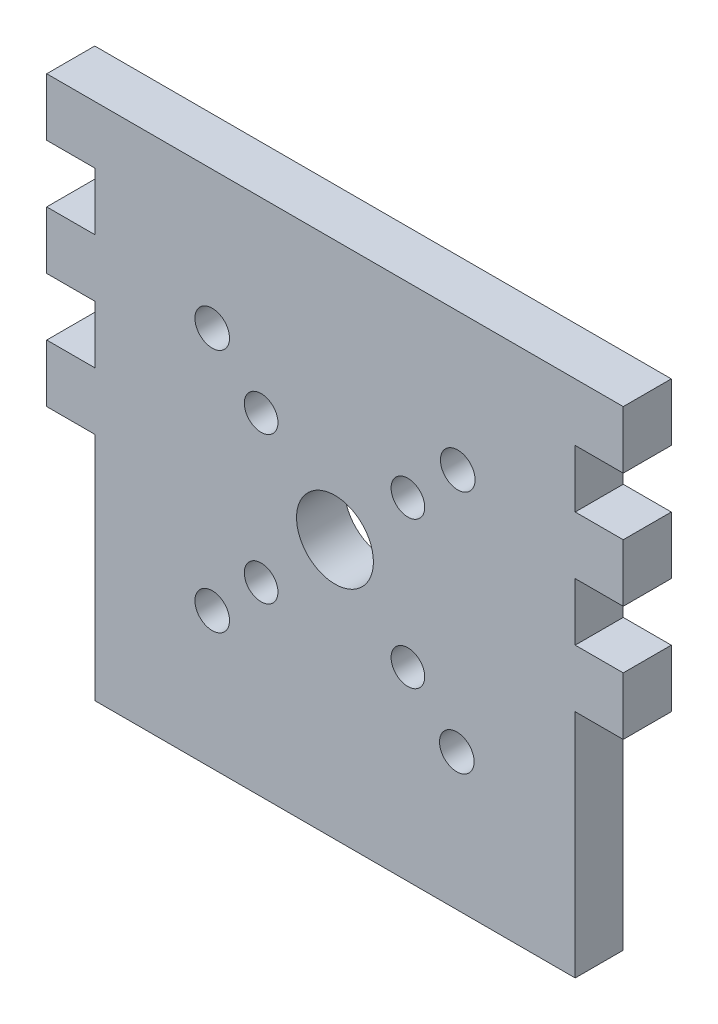
ISO-10303-21;
HEADER;
FILE_DESCRIPTION(('STEP AP214'),'2;1');
FILE_NAME('part.step','',(''),(''),'','','');
FILE_SCHEMA(('AUTOMOTIVE_DESIGN { 1 0 10303 214 1 1 1 1 }'));
ENDSEC;
DATA;
#1=APPLICATION_CONTEXT('core data for automotive mechanical design processes');
#2=APPLICATION_PROTOCOL_DEFINITION('international standard','automotive_design',2000,#1);
#3=PRODUCT_CONTEXT('',#1,'mechanical');
#4=PRODUCT('Part','Part','',(#3));
#5=PRODUCT_RELATED_PRODUCT_CATEGORY('part','',(#4));
#6=PRODUCT_DEFINITION_FORMATION('','',#4);
#7=PRODUCT_DEFINITION_CONTEXT('part definition',#1,'design');
#8=PRODUCT_DEFINITION('design','',#6,#7);
#9=PRODUCT_DEFINITION_SHAPE('','',#8);
#10=(LENGTH_UNIT() NAMED_UNIT(*) SI_UNIT(.MILLI.,.METRE.));
#11=(NAMED_UNIT(*) PLANE_ANGLE_UNIT() SI_UNIT($,.RADIAN.));
#12=(NAMED_UNIT(*) SI_UNIT($,.STERADIAN.) SOLID_ANGLE_UNIT());
#13=UNCERTAINTY_MEASURE_WITH_UNIT(LENGTH_MEASURE(1.E-05),#10,'distance_accuracy_value','');
#14=(GEOMETRIC_REPRESENTATION_CONTEXT(3) GLOBAL_UNCERTAINTY_ASSIGNED_CONTEXT((#13)) GLOBAL_UNIT_ASSIGNED_CONTEXT((#10,
#11,#12)) REPRESENTATION_CONTEXT('',''));
#15=CARTESIAN_POINT('',(0.,0.,0.));
#16=DIRECTION('',(0.,0.,1.));
#17=DIRECTION('',(1.,0.,0.));
#18=AXIS2_PLACEMENT_3D('',#15,#16,#17);
#19=CARTESIAN_POINT('',(0.,0.,6.35));
#20=DIRECTION('',(0.,0.,1.));
#21=DIRECTION('',(1.,0.,0.));
#22=AXIS2_PLACEMENT_3D('',#19,#20,#21);
#23=PLANE('',#22);
#24=CARTESIAN_POINT('',(-9.54141995097613,-15.2310975307996,6.35));
#25=DIRECTION('',(0.,0.,1.));
#26=DIRECTION('',(1.,0.,0.));
#27=AXIS2_PLACEMENT_3D('',#24,#25,#26);
#28=CIRCLE('',#27,2.2225);
#29=CARTESIAN_POINT('',(-7.31891995097614,-15.2310975307996,6.35));
#30=VERTEX_POINT('',#29);
#31=EDGE_CURVE('E826',#30,#30,#28,.T.);
#32=ORIENTED_EDGE('',*,*,#31,.F.);
#33=EDGE_LOOP('',(#32));
#34=FACE_BOUND('',#33,.T.);
#35=CARTESIAN_POINT('',(16.445546790803,-8.76382905717028,6.35));
#36=DIRECTION('',(0.,0.,1.));
#37=DIRECTION('',(-1.,0.,0.));
#38=AXIS2_PLACEMENT_3D('',#35,#36,#37);
#39=CIRCLE('',#38,2.286);
#40=CARTESIAN_POINT('',(14.159546790803,-8.76382905717028,6.35));
#41=VERTEX_POINT('',#40);
#42=EDGE_CURVE('E832',#41,#41,#39,.T.);
#43=ORIENTED_EDGE('',*,*,#42,.F.);
#44=EDGE_LOOP('',(#43));
#45=FACE_BOUND('',#44,.T.);
#46=CARTESIAN_POINT('',(-16.0057199509761,-8.76382905717027,6.35));
#47=DIRECTION('',(0.,0.,1.));
#48=DIRECTION('',(1.,0.,0.));
#49=AXIS2_PLACEMENT_3D('',#46,#47,#48);
#50=CIRCLE('',#49,2.286);
#51=CARTESIAN_POINT('',(-13.7197199509761,-8.76382905717027,6.35));
#52=VERTEX_POINT('',#51);
#53=EDGE_CURVE('E851',#52,#52,#50,.T.);
#54=ORIENTED_EDGE('',*,*,#53,.F.);
#55=EDGE_LOOP('',(#54));
#56=FACE_BOUND('',#55,.T.);
#57=CARTESIAN_POINT('',(-9.54162498368874,-34.6282483603121,6.35));
#58=DIRECTION('',(0.,0.,1.));
#59=DIRECTION('',(1.,0.,0.));
#60=AXIS2_PLACEMENT_3D('',#57,#58,#59);
#61=CIRCLE('',#60,2.2225);
#62=CARTESIAN_POINT('',(-7.31912498368874,-34.6282483603121,6.35));
#63=VERTEX_POINT('',#62);
#64=EDGE_CURVE('E843',#63,#63,#61,.T.);
#65=ORIENTED_EDGE('',*,*,#64,.F.);
#66=EDGE_LOOP('',(#65));
#67=FACE_BOUND('',#66,.T.);
#68=CARTESIAN_POINT('',(9.85552584582378,-34.6284533930247,6.35));
#69=DIRECTION('',(0.,0.,1.));
#70=DIRECTION('',(1.,0.,0.));
#71=AXIS2_PLACEMENT_3D('',#68,#69,#70);
#72=CIRCLE('',#71,2.2225);
#73=CARTESIAN_POINT('',(12.0780258458238,-34.6284533930247,6.35));
#74=VERTEX_POINT('',#73);
#75=EDGE_CURVE('E884',#74,#74,#72,.T.);
#76=ORIENTED_EDGE('',*,*,#75,.F.);
#77=EDGE_LOOP('',(#76));
#78=FACE_BOUND('',#77,.T.);
#79=CARTESIAN_POINT('',(-16.005719950975,-41.0927510930191,6.35));
#80=DIRECTION('',(0.,0.,1.));
#81=DIRECTION('',(1.,0.,0.));
#82=AXIS2_PLACEMENT_3D('',#79,#80,#81);
#83=CIRCLE('',#82,2.286);
#84=CARTESIAN_POINT('',(-13.719719950975,-41.0927510930191,6.35));
#85=VERTEX_POINT('',#84);
#86=EDGE_CURVE('E892',#85,#85,#83,.T.);
#87=ORIENTED_EDGE('',*,*,#86,.F.);
#88=EDGE_LOOP('',(#87));
#89=FACE_BOUND('',#88,.T.);
#90=CARTESIAN_POINT('',(16.323202084874,-41.092751093018,6.35));
#91=DIRECTION('',(0.,0.,1.));
#92=DIRECTION('',(1.,0.,0.));
#93=AXIS2_PLACEMENT_3D('',#90,#91,#92);
#94=CIRCLE('',#93,2.286);
#95=CARTESIAN_POINT('',(18.609202084874,-41.092751093018,6.35));
#96=VERTEX_POINT('',#95);
#97=EDGE_CURVE('E872',#96,#96,#94,.T.);
#98=ORIENTED_EDGE('',*,*,#97,.F.);
#99=EDGE_LOOP('',(#98));
#100=FACE_BOUND('',#99,.T.);
#101=CARTESIAN_POINT('',(9.85573087853638,-15.2313025635122,6.35));
#102=DIRECTION('',(0.,0.,1.));
#103=DIRECTION('',(1.,0.,0.));
#104=AXIS2_PLACEMENT_3D('',#101,#102,#103);
#105=CIRCLE('',#104,2.2225);
#106=CARTESIAN_POINT('',(12.0782308785364,-15.2313025635122,6.35));
#107=VERTEX_POINT('',#106);
#108=EDGE_CURVE('E835',#107,#107,#105,.T.);
#109=ORIENTED_EDGE('',*,*,#108,.F.);
#110=EDGE_LOOP('',(#109));
#111=FACE_BOUND('',#110,.T.);
#112=CARTESIAN_POINT('',(0.219913419913426,-24.86670995671,6.35));
#113=DIRECTION('',(0.,0.,1.));
#114=DIRECTION('',(1.,0.,0.));
#115=AXIS2_PLACEMENT_3D('',#112,#113,#114);
#116=CIRCLE('',#115,5.08);
#117=CARTESIAN_POINT('',(5.29991341991343,-24.86670995671,6.35));
#118=VERTEX_POINT('',#117);
#119=EDGE_CURVE('E240',#118,#118,#116,.T.);
#120=ORIENTED_EDGE('',*,*,#119,.F.);
#121=EDGE_LOOP('',(#120));
#122=FACE_BOUND('',#121,.T.);
#123=DIRECTION('',(0.,1.,0.));
#124=VECTOR('',#123,1.);
#125=CARTESIAN_POINT('',(38.3199134199134,17.04329004329,6.35));
#126=LINE('',#125,#124);
#127=CARTESIAN_POINT('',(38.3199134199135,1.80329004329005,6.35));
#128=VERTEX_POINT('',#127);
#129=CARTESIAN_POINT('',(38.3199134199135,9.42329004329004,6.35));
#130=VERTEX_POINT('',#129);
#131=EDGE_CURVE('E54',#128,#130,#126,.T.);
#132=ORIENTED_EDGE('',*,*,#131,.T.);
#133=DIRECTION('',(1.,0.,0.));
#134=VECTOR('',#133,1.);
#135=CARTESIAN_POINT('',(-31.5300865800866,9.42329004329005,6.35));
#136=LINE('',#135,#134);
#137=CARTESIAN_POINT('',(-37.8800865800866,9.42329004329005,6.35));
#138=VERTEX_POINT('',#137);
#139=EDGE_CURVE('E347',#138,#130,#136,.T.);
#140=ORIENTED_EDGE('',*,*,#139,.F.);
#141=DIRECTION('',(0.,-1.,0.));
#142=VECTOR('',#141,1.);
#143=CARTESIAN_POINT('',(-37.8800865800866,17.04329004329,6.35));
#144=LINE('',#143,#142);
#145=CARTESIAN_POINT('',(-37.8800865800866,1.80329004329005,6.35));
#146=VERTEX_POINT('',#145);
#147=EDGE_CURVE('E438',#138,#146,#144,.T.);
#148=ORIENTED_EDGE('',*,*,#147,.T.);
#149=DIRECTION('',(-1.,0.,0.));
#150=VECTOR('',#149,1.);
#151=CARTESIAN_POINT('',(-37.8800865800866,1.80329004329005,6.35));
#152=LINE('',#151,#150);
#153=CARTESIAN_POINT('',(-31.5300865800866,1.80329004329005,6.35));
#154=VERTEX_POINT('',#153);
#155=EDGE_CURVE('E344',#154,#146,#152,.T.);
#156=ORIENTED_EDGE('',*,*,#155,.F.);
#157=DIRECTION('',(0.,1.,0.));
#158=VECTOR('',#157,1.);
#159=CARTESIAN_POINT('',(-31.5300865800866,1.80329004329005,6.35));
#160=LINE('',#159,#158);
#161=CARTESIAN_POINT('',(-31.5300865800866,-5.81670995670995,6.35));
#162=VERTEX_POINT('',#161);
#163=EDGE_CURVE('E340',#162,#154,#160,.T.);
#164=ORIENTED_EDGE('',*,*,#163,.F.);
#165=DIRECTION('',(1.,0.,0.));
#166=VECTOR('',#165,1.);
#167=CARTESIAN_POINT('',(-31.5300865800866,-5.81670995670995,6.35));
#168=LINE('',#167,#166);
#169=CARTESIAN_POINT('',(-37.8800865800866,-5.81670995670995,6.35));
#170=VERTEX_POINT('',#169);
#171=EDGE_CURVE('E336',#170,#162,#168,.T.);
#172=ORIENTED_EDGE('',*,*,#171,.F.);
#173=CARTESIAN_POINT('',(-37.8800865800866,-13.4367099567099,6.35));
#174=VERTEX_POINT('',#173);
#175=EDGE_CURVE('E434',#170,#174,#144,.T.);
#176=ORIENTED_EDGE('',*,*,#175,.T.);
#177=DIRECTION('',(-1.,0.,0.));
#178=VECTOR('',#177,1.);
#179=CARTESIAN_POINT('',(-37.8800865800866,-13.4367099567099,6.35));
#180=LINE('',#179,#178);
#181=CARTESIAN_POINT('',(-31.5300865800866,-13.4367099567099,6.35));
#182=VERTEX_POINT('',#181);
#183=EDGE_CURVE('E332',#182,#174,#180,.T.);
#184=ORIENTED_EDGE('',*,*,#183,.F.);
#185=DIRECTION('',(0.,1.,0.));
#186=VECTOR('',#185,1.);
#187=CARTESIAN_POINT('',(-31.5300865800866,-13.4367099567099,6.35));
#188=LINE('',#187,#186);
#189=CARTESIAN_POINT('',(-31.5300865800866,-21.0567099567099,6.35));
#190=VERTEX_POINT('',#189);
#191=EDGE_CURVE('E333',#190,#182,#188,.T.);
#192=ORIENTED_EDGE('',*,*,#191,.F.);
#193=DIRECTION('',(-1.,0.,0.));
#194=VECTOR('',#193,1.);
#195=CARTESIAN_POINT('',(0.,-21.0567099567099,6.35));
#196=LINE('',#195,#194);
#197=CARTESIAN_POINT('',(-37.8800865800866,-21.05670995671,6.35));
#198=VERTEX_POINT('',#197);
#199=EDGE_CURVE('E263',#190,#198,#196,.T.);
#200=ORIENTED_EDGE('',*,*,#199,.T.);
#201=DIRECTION('',(0.,-1.,0.));
#202=VECTOR('',#201,1.);
#203=CARTESIAN_POINT('',(-37.8800865800866,0.,6.35));
#204=LINE('',#203,#202);
#205=CARTESIAN_POINT('',(-37.8800865800866,-28.6767099567099,6.35));
#206=VERTEX_POINT('',#205);
#207=EDGE_CURVE('E253',#198,#206,#204,.T.);
#208=ORIENTED_EDGE('',*,*,#207,.T.);
#209=DIRECTION('',(1.,0.,0.));
#210=VECTOR('',#209,1.);
#211=CARTESIAN_POINT('',(0.,-28.6767099567099,6.35));
#212=LINE('',#211,#210);
#213=CARTESIAN_POINT('',(-31.5300865800866,-28.6767099567099,6.35));
#214=VERTEX_POINT('',#213);
#215=EDGE_CURVE('E275',#206,#214,#212,.T.);
#216=ORIENTED_EDGE('',*,*,#215,.T.);
#217=CARTESIAN_POINT('',(-31.5300865800866,-59.15670995671,6.35));
#218=VERTEX_POINT('',#217);
#219=EDGE_CURVE('E329',#218,#214,#188,.T.);
#220=ORIENTED_EDGE('',*,*,#219,.F.);
#221=DIRECTION('',(1.,0.,0.));
#222=VECTOR('',#221,1.);
#223=CARTESIAN_POINT('',(-37.8800865800866,-59.15670995671,6.35));
#224=LINE('',#223,#222);
#225=CARTESIAN_POINT('',(31.9699134199135,-59.15670995671,6.35));
#226=VERTEX_POINT('',#225);
#227=EDGE_CURVE('E440',#218,#226,#224,.T.);
#228=ORIENTED_EDGE('',*,*,#227,.T.);
#229=DIRECTION('',(0.,-1.,0.));
#230=VECTOR('',#229,1.);
#231=CARTESIAN_POINT('',(31.9699134199135,-13.4367099567099,6.35));
#232=LINE('',#231,#230);
#233=CARTESIAN_POINT('',(31.9699134199135,-28.6767099567099,6.35));
#234=VERTEX_POINT('',#233);
#235=EDGE_CURVE('E409',#234,#226,#232,.T.);
#236=ORIENTED_EDGE('',*,*,#235,.F.);
#237=DIRECTION('',(-1.,0.,0.));
#238=VECTOR('',#237,1.);
#239=CARTESIAN_POINT('',(0.,-28.6767099567099,6.35));
#240=LINE('',#239,#238);
#241=CARTESIAN_POINT('',(38.3199134199134,-28.6767099567099,6.35));
#242=VERTEX_POINT('',#241);
#243=EDGE_CURVE('E245',#242,#234,#240,.T.);
#244=ORIENTED_EDGE('',*,*,#243,.F.);
#245=DIRECTION('',(0.,-1.,0.));
#246=VECTOR('',#245,1.);
#247=CARTESIAN_POINT('',(38.3199134199135,0.,6.35));
#248=LINE('',#247,#246);
#249=CARTESIAN_POINT('',(38.3199134199135,-21.0567099567099,6.35));
#250=VERTEX_POINT('',#249);
#251=EDGE_CURVE('E225',#250,#242,#248,.T.);
#252=ORIENTED_EDGE('',*,*,#251,.F.);
#253=DIRECTION('',(1.,0.,0.));
#254=VECTOR('',#253,1.);
#255=CARTESIAN_POINT('',(0.,-21.0567099567099,6.35));
#256=LINE('',#255,#254);
#257=CARTESIAN_POINT('',(31.9699134199135,-21.0567099567099,6.35));
#258=VERTEX_POINT('',#257);
#259=EDGE_CURVE('E235',#258,#250,#256,.T.);
#260=ORIENTED_EDGE('',*,*,#259,.F.);
#261=CARTESIAN_POINT('',(31.9699134199135,-13.4367099567099,6.35));
#262=VERTEX_POINT('',#261);
#263=EDGE_CURVE('E379',#262,#258,#232,.T.);
#264=ORIENTED_EDGE('',*,*,#263,.F.);
#265=DIRECTION('',(-1.,0.,0.));
#266=VECTOR('',#265,1.);
#267=CARTESIAN_POINT('',(38.3199134199135,-13.4367099567099,6.35));
#268=LINE('',#267,#266);
#269=CARTESIAN_POINT('',(38.3199134199135,-13.4367099567099,6.35));
#270=VERTEX_POINT('',#269);
#271=EDGE_CURVE('E405',#270,#262,#268,.T.);
#272=ORIENTED_EDGE('',*,*,#271,.F.);
#273=CARTESIAN_POINT('',(38.3199134199135,-5.81670995670994,6.35));
#274=VERTEX_POINT('',#273);
#275=EDGE_CURVE('E11',#270,#274,#126,.T.);
#276=ORIENTED_EDGE('',*,*,#275,.T.);
#277=DIRECTION('',(1.,0.,0.));
#278=VECTOR('',#277,1.);
#279=CARTESIAN_POINT('',(31.9699134199135,-5.81670995670994,6.35));
#280=LINE('',#279,#278);
#281=CARTESIAN_POINT('',(31.9699134199135,-5.81670995670994,6.35));
#282=VERTEX_POINT('',#281);
#283=EDGE_CURVE('E402',#282,#274,#280,.T.);
#284=ORIENTED_EDGE('',*,*,#283,.F.);
#285=DIRECTION('',(0.,-1.,0.));
#286=VECTOR('',#285,1.);
#287=CARTESIAN_POINT('',(31.9699134199135,1.80329004329005,6.35));
#288=LINE('',#287,#286);
#289=CARTESIAN_POINT('',(31.9699134199135,1.80329004329005,6.35));
#290=VERTEX_POINT('',#289);
#291=EDGE_CURVE('E398',#290,#282,#288,.T.);
#292=ORIENTED_EDGE('',*,*,#291,.F.);
#293=DIRECTION('',(-1.,0.,0.));
#294=VECTOR('',#293,1.);
#295=CARTESIAN_POINT('',(38.3199134199135,1.80329004329005,6.35));
#296=LINE('',#295,#294);
#297=EDGE_CURVE('E300',#128,#290,#296,.T.);
#298=ORIENTED_EDGE('',*,*,#297,.F.);
#299=EDGE_LOOP('',(#132,#140,#148,#156,#164,#172,#176,#184,#192,#200,#208,#216,#220,#228,#236,
#244,#252,#260,#264,#272,#276,#284,#292,#298));
#300=FACE_BOUND('',#299,.T.);
#301=ADVANCED_FACE('F44',(#34,#45,#56,#67,#78,#89,#100,#111,#122,#300),#23,.T.);
#302=CARTESIAN_POINT('',(0.,0.,0.));
#303=DIRECTION('',(0.,0.,1.));
#304=DIRECTION('',(1.,0.,0.));
#305=AXIS2_PLACEMENT_3D('',#302,#303,#304);
#306=PLANE('',#305);
#307=CARTESIAN_POINT('',(-9.54141995097613,-15.2310975307996,0.));
#308=DIRECTION('',(0.,0.,1.));
#309=DIRECTION('',(1.,0.,0.));
#310=AXIS2_PLACEMENT_3D('',#307,#308,#309);
#311=CIRCLE('',#310,2.2225);
#312=CARTESIAN_POINT('',(-7.31891995097614,-15.2310975307996,0.));
#313=VERTEX_POINT('',#312);
#314=EDGE_CURVE('E824',#313,#313,#311,.T.);
#315=ORIENTED_EDGE('',*,*,#314,.T.);
#316=EDGE_LOOP('',(#315));
#317=FACE_BOUND('',#316,.T.);
#318=CARTESIAN_POINT('',(16.445546790803,-8.76382905717028,0.));
#319=DIRECTION('',(0.,0.,1.));
#320=DIRECTION('',(-1.,0.,0.));
#321=AXIS2_PLACEMENT_3D('',#318,#319,#320);
#322=CIRCLE('',#321,2.286);
#323=CARTESIAN_POINT('',(14.159546790803,-8.76382905717028,0.));
#324=VERTEX_POINT('',#323);
#325=EDGE_CURVE('E854',#324,#324,#322,.T.);
#326=ORIENTED_EDGE('',*,*,#325,.T.);
#327=EDGE_LOOP('',(#326));
#328=FACE_BOUND('',#327,.T.);
#329=CARTESIAN_POINT('',(-16.0057199509761,-8.76382905717027,0.));
#330=DIRECTION('',(0.,0.,1.));
#331=DIRECTION('',(1.,0.,0.));
#332=AXIS2_PLACEMENT_3D('',#329,#330,#331);
#333=CIRCLE('',#332,2.286);
#334=CARTESIAN_POINT('',(-13.7197199509761,-8.76382905717027,0.));
#335=VERTEX_POINT('',#334);
#336=EDGE_CURVE('E847',#335,#335,#333,.T.);
#337=ORIENTED_EDGE('',*,*,#336,.T.);
#338=EDGE_LOOP('',(#337));
#339=FACE_BOUND('',#338,.T.);
#340=CARTESIAN_POINT('',(-9.54162498368874,-34.6282483603121,0.));
#341=DIRECTION('',(0.,0.,1.));
#342=DIRECTION('',(1.,0.,0.));
#343=AXIS2_PLACEMENT_3D('',#340,#341,#342);
#344=CIRCLE('',#343,2.2225);
#345=CARTESIAN_POINT('',(-7.31912498368874,-34.6282483603121,0.));
#346=VERTEX_POINT('',#345);
#347=EDGE_CURVE('E839',#346,#346,#344,.T.);
#348=ORIENTED_EDGE('',*,*,#347,.T.);
#349=EDGE_LOOP('',(#348));
#350=FACE_BOUND('',#349,.T.);
#351=CARTESIAN_POINT('',(9.85552584582378,-34.6284533930247,0.));
#352=DIRECTION('',(0.,0.,1.));
#353=DIRECTION('',(1.,0.,0.));
#354=AXIS2_PLACEMENT_3D('',#351,#352,#353);
#355=CIRCLE('',#354,2.2225);
#356=CARTESIAN_POINT('',(12.0780258458238,-34.6284533930247,0.));
#357=VERTEX_POINT('',#356);
#358=EDGE_CURVE('E888',#357,#357,#355,.T.);
#359=ORIENTED_EDGE('',*,*,#358,.T.);
#360=EDGE_LOOP('',(#359));
#361=FACE_BOUND('',#360,.T.);
#362=CARTESIAN_POINT('',(-16.005719950975,-41.0927510930191,0.));
#363=DIRECTION('',(0.,0.,1.));
#364=DIRECTION('',(1.,0.,0.));
#365=AXIS2_PLACEMENT_3D('',#362,#363,#364);
#366=CIRCLE('',#365,2.286);
#367=CARTESIAN_POINT('',(-13.719719950975,-41.0927510930191,0.));
#368=VERTEX_POINT('',#367);
#369=EDGE_CURVE('E877',#368,#368,#366,.T.);
#370=ORIENTED_EDGE('',*,*,#369,.T.);
#371=EDGE_LOOP('',(#370));
#372=FACE_BOUND('',#371,.T.);
#373=CARTESIAN_POINT('',(16.323202084874,-41.092751093018,0.));
#374=DIRECTION('',(0.,0.,1.));
#375=DIRECTION('',(1.,0.,0.));
#376=AXIS2_PLACEMENT_3D('',#373,#374,#375);
#377=CIRCLE('',#376,2.286);
#378=CARTESIAN_POINT('',(18.609202084874,-41.092751093018,0.));
#379=VERTEX_POINT('',#378);
#380=EDGE_CURVE('E876',#379,#379,#377,.T.);
#381=ORIENTED_EDGE('',*,*,#380,.T.);
#382=EDGE_LOOP('',(#381));
#383=FACE_BOUND('',#382,.T.);
#384=CARTESIAN_POINT('',(9.85573087853638,-15.2313025635122,0.));
#385=DIRECTION('',(0.,0.,1.));
#386=DIRECTION('',(1.,0.,0.));
#387=AXIS2_PLACEMENT_3D('',#384,#385,#386);
#388=CIRCLE('',#387,2.2225);
#389=CARTESIAN_POINT('',(12.0782308785364,-15.2313025635122,0.));
#390=VERTEX_POINT('',#389);
#391=EDGE_CURVE('E828',#390,#390,#388,.T.);
#392=ORIENTED_EDGE('',*,*,#391,.T.);
#393=EDGE_LOOP('',(#392));
#394=FACE_BOUND('',#393,.T.);
#395=CARTESIAN_POINT('',(0.219913419913426,-24.86670995671,0.));
#396=DIRECTION('',(0.,0.,1.));
#397=DIRECTION('',(1.,0.,0.));
#398=AXIS2_PLACEMENT_3D('',#395,#396,#397);
#399=CIRCLE('',#398,5.08);
#400=CARTESIAN_POINT('',(5.29991341991343,-24.86670995671,0.));
#401=VERTEX_POINT('',#400);
#402=EDGE_CURVE('E248',#401,#401,#399,.T.);
#403=ORIENTED_EDGE('',*,*,#402,.T.);
#404=EDGE_LOOP('',(#403));
#405=FACE_BOUND('',#404,.T.);
#406=DIRECTION('',(1.,0.,0.));
#407=VECTOR('',#406,1.);
#408=CARTESIAN_POINT('',(-31.5300865800866,9.42329004329005,0.));
#409=LINE('',#408,#407);
#410=CARTESIAN_POINT('',(-37.8800865800866,9.42329004329005,0.));
#411=VERTEX_POINT('',#410);
#412=CARTESIAN_POINT('',(38.3199134199135,9.42329004329004,0.));
#413=VERTEX_POINT('',#412);
#414=EDGE_CURVE('E325',#411,#413,#409,.T.);
#415=ORIENTED_EDGE('',*,*,#414,.T.);
#416=DIRECTION('',(0.,1.,0.));
#417=VECTOR('',#416,1.);
#418=CARTESIAN_POINT('',(38.3199134199134,17.04329004329,0.));
#419=LINE('',#418,#417);
#420=CARTESIAN_POINT('',(38.3199134199135,1.80329004329005,0.));
#421=VERTEX_POINT('',#420);
#422=EDGE_CURVE('E48',#421,#413,#419,.T.);
#423=ORIENTED_EDGE('',*,*,#422,.F.);
#424=DIRECTION('',(-1.,0.,0.));
#425=VECTOR('',#424,1.);
#426=CARTESIAN_POINT('',(38.3199134199135,1.80329004329005,0.));
#427=LINE('',#426,#425);
#428=CARTESIAN_POINT('',(31.9699134199135,1.80329004329005,0.));
#429=VERTEX_POINT('',#428);
#430=EDGE_CURVE('E374',#421,#429,#427,.T.);
#431=ORIENTED_EDGE('',*,*,#430,.T.);
#432=DIRECTION('',(0.,-1.,0.));
#433=VECTOR('',#432,1.);
#434=CARTESIAN_POINT('',(31.9699134199135,1.80329004329005,0.));
#435=LINE('',#434,#433);
#436=CARTESIAN_POINT('',(31.9699134199135,-5.81670995670994,0.));
#437=VERTEX_POINT('',#436);
#438=EDGE_CURVE('E378',#429,#437,#435,.T.);
#439=ORIENTED_EDGE('',*,*,#438,.T.);
#440=DIRECTION('',(1.,0.,0.));
#441=VECTOR('',#440,1.);
#442=CARTESIAN_POINT('',(31.9699134199135,-5.81670995670994,0.));
#443=LINE('',#442,#441);
#444=CARTESIAN_POINT('',(38.3199134199135,-5.81670995670994,0.));
#445=VERTEX_POINT('',#444);
#446=EDGE_CURVE('E383',#437,#445,#443,.T.);
#447=ORIENTED_EDGE('',*,*,#446,.T.);
#448=CARTESIAN_POINT('',(38.3199134199135,-13.4367099567099,0.));
#449=VERTEX_POINT('',#448);
#450=EDGE_CURVE('E439',#449,#445,#419,.T.);
#451=ORIENTED_EDGE('',*,*,#450,.F.);
#452=DIRECTION('',(-1.,0.,0.));
#453=VECTOR('',#452,1.);
#454=CARTESIAN_POINT('',(38.3199134199135,-13.4367099567099,0.));
#455=LINE('',#454,#453);
#456=CARTESIAN_POINT('',(31.9699134199135,-13.4367099567099,0.));
#457=VERTEX_POINT('',#456);
#458=EDGE_CURVE('E387',#449,#457,#455,.T.);
#459=ORIENTED_EDGE('',*,*,#458,.T.);
#460=DIRECTION('',(0.,-1.,0.));
#461=VECTOR('',#460,1.);
#462=CARTESIAN_POINT('',(31.9699134199135,-13.4367099567099,0.));
#463=LINE('',#462,#461);
#464=CARTESIAN_POINT('',(31.9699134199135,-21.0567099567099,0.));
#465=VERTEX_POINT('',#464);
#466=EDGE_CURVE('E391',#457,#465,#463,.T.);
#467=ORIENTED_EDGE('',*,*,#466,.T.);
#468=DIRECTION('',(1.,0.,0.));
#469=VECTOR('',#468,1.);
#470=CARTESIAN_POINT('',(0.,-21.0567099567099,0.));
#471=LINE('',#470,#469);
#472=CARTESIAN_POINT('',(38.3199134199135,-21.0567099567099,0.));
#473=VERTEX_POINT('',#472);
#474=EDGE_CURVE('E215',#465,#473,#471,.T.);
#475=ORIENTED_EDGE('',*,*,#474,.T.);
#476=DIRECTION('',(0.,-1.,0.));
#477=VECTOR('',#476,1.);
#478=CARTESIAN_POINT('',(38.3199134199135,0.,0.));
#479=LINE('',#478,#477);
#480=CARTESIAN_POINT('',(38.3199134199134,-28.6767099567099,0.));
#481=VERTEX_POINT('',#480);
#482=EDGE_CURVE('E208',#473,#481,#479,.T.);
#483=ORIENTED_EDGE('',*,*,#482,.T.);
#484=DIRECTION('',(-1.,0.,0.));
#485=VECTOR('',#484,1.);
#486=CARTESIAN_POINT('',(0.,-28.6767099567099,0.));
#487=LINE('',#486,#485);
#488=CARTESIAN_POINT('',(31.9699134199135,-28.6767099567099,0.));
#489=VERTEX_POINT('',#488);
#490=EDGE_CURVE('E212',#481,#489,#487,.T.);
#491=ORIENTED_EDGE('',*,*,#490,.T.);
#492=CARTESIAN_POINT('',(31.9699134199135,-59.15670995671,0.));
#493=VERTEX_POINT('',#492);
#494=EDGE_CURVE('E62',#489,#493,#463,.T.);
#495=ORIENTED_EDGE('',*,*,#494,.T.);
#496=DIRECTION('',(1.,0.,0.));
#497=VECTOR('',#496,1.);
#498=CARTESIAN_POINT('',(-37.8800865800866,-59.15670995671,0.));
#499=LINE('',#498,#497);
#500=CARTESIAN_POINT('',(-31.5300865800866,-59.15670995671,0.));
#501=VERTEX_POINT('',#500);
#502=EDGE_CURVE('E449',#501,#493,#499,.T.);
#503=ORIENTED_EDGE('',*,*,#502,.F.);
#504=DIRECTION('',(0.,1.,0.));
#505=VECTOR('',#504,1.);
#506=CARTESIAN_POINT('',(-31.5300865800866,-13.4367099567099,0.));
#507=LINE('',#506,#505);
#508=CARTESIAN_POINT('',(-31.5300865800866,-28.6767099567099,0.));
#509=VERTEX_POINT('',#508);
#510=EDGE_CURVE('E304',#501,#509,#507,.T.);
#511=ORIENTED_EDGE('',*,*,#510,.T.);
#512=DIRECTION('',(1.,0.,0.));
#513=VECTOR('',#512,1.);
#514=CARTESIAN_POINT('',(0.,-28.6767099567099,0.));
#515=LINE('',#514,#513);
#516=CARTESIAN_POINT('',(-37.8800865800866,-28.6767099567099,0.));
#517=VERTEX_POINT('',#516);
#518=EDGE_CURVE('E262',#517,#509,#515,.T.);
#519=ORIENTED_EDGE('',*,*,#518,.F.);
#520=DIRECTION('',(0.,-1.,0.));
#521=VECTOR('',#520,1.);
#522=CARTESIAN_POINT('',(-37.8800865800866,0.,0.));
#523=LINE('',#522,#521);
#524=CARTESIAN_POINT('',(-37.8800865800866,-21.05670995671,0.));
#525=VERTEX_POINT('',#524);
#526=EDGE_CURVE('E258',#525,#517,#523,.T.);
#527=ORIENTED_EDGE('',*,*,#526,.F.);
#528=DIRECTION('',(-1.,0.,0.));
#529=VECTOR('',#528,1.);
#530=CARTESIAN_POINT('',(0.,-21.0567099567099,0.));
#531=LINE('',#530,#529);
#532=CARTESIAN_POINT('',(-31.5300865800866,-21.0567099567099,0.));
#533=VERTEX_POINT('',#532);
#534=EDGE_CURVE('E267',#533,#525,#531,.T.);
#535=ORIENTED_EDGE('',*,*,#534,.F.);
#536=CARTESIAN_POINT('',(-31.5300865800866,-13.4367099567099,0.));
#537=VERTEX_POINT('',#536);
#538=EDGE_CURVE('E309',#533,#537,#507,.T.);
#539=ORIENTED_EDGE('',*,*,#538,.T.);
#540=DIRECTION('',(-1.,0.,0.));
#541=VECTOR('',#540,1.);
#542=CARTESIAN_POINT('',(-37.8800865800866,-13.4367099567099,0.));
#543=LINE('',#542,#541);
#544=CARTESIAN_POINT('',(-37.8800865800866,-13.4367099567099,0.));
#545=VERTEX_POINT('',#544);
#546=EDGE_CURVE('E308',#537,#545,#543,.T.);
#547=ORIENTED_EDGE('',*,*,#546,.T.);
#548=DIRECTION('',(0.,-1.,0.));
#549=VECTOR('',#548,1.);
#550=CARTESIAN_POINT('',(-37.8800865800866,17.04329004329,0.));
#551=LINE('',#550,#549);
#552=CARTESIAN_POINT('',(-37.8800865800866,-5.81670995670995,0.));
#553=VERTEX_POINT('',#552);
#554=EDGE_CURVE('E353',#553,#545,#551,.T.);
#555=ORIENTED_EDGE('',*,*,#554,.F.);
#556=DIRECTION('',(1.,0.,0.));
#557=VECTOR('',#556,1.);
#558=CARTESIAN_POINT('',(-31.5300865800866,-5.81670995670995,0.));
#559=LINE('',#558,#557);
#560=CARTESIAN_POINT('',(-31.5300865800866,-5.81670995670995,0.));
#561=VERTEX_POINT('',#560);
#562=EDGE_CURVE('E313',#553,#561,#559,.T.);
#563=ORIENTED_EDGE('',*,*,#562,.T.);
#564=DIRECTION('',(0.,1.,0.));
#565=VECTOR('',#564,1.);
#566=CARTESIAN_POINT('',(-31.5300865800866,1.80329004329005,0.));
#567=LINE('',#566,#565);
#568=CARTESIAN_POINT('',(-31.5300865800866,1.80329004329005,0.));
#569=VERTEX_POINT('',#568);
#570=EDGE_CURVE('E317',#561,#569,#567,.T.);
#571=ORIENTED_EDGE('',*,*,#570,.T.);
#572=DIRECTION('',(-1.,0.,0.));
#573=VECTOR('',#572,1.);
#574=CARTESIAN_POINT('',(-37.8800865800866,1.80329004329005,0.));
#575=LINE('',#574,#573);
#576=CARTESIAN_POINT('',(-37.8800865800866,1.80329004329005,0.));
#577=VERTEX_POINT('',#576);
#578=EDGE_CURVE('E321',#569,#577,#575,.T.);
#579=ORIENTED_EDGE('',*,*,#578,.T.);
#580=EDGE_CURVE('E448',#411,#577,#551,.T.);
#581=ORIENTED_EDGE('',*,*,#580,.F.);
#582=EDGE_LOOP('',(#415,#423,#431,#439,#447,#451,#459,#467,#475,#483,#491,#495,#503,#511,#519,
#527,#535,#539,#547,#555,#563,#571,#579,#581));
#583=FACE_BOUND('',#582,.T.);
#584=ADVANCED_FACE('F210',(#317,#328,#339,#350,#361,#372,#383,#394,#405,#583),#306,.F.);
#585=CARTESIAN_POINT('',(31.9699134199135,-13.4367099567099,0.));
#586=DIRECTION('',(-1.,0.,0.));
#587=DIRECTION('',(0.,0.,1.));
#588=AXIS2_PLACEMENT_3D('',#585,#586,#587);
#589=PLANE('',#588);
#590=DIRECTION('',(0.,0.,1.));
#591=VECTOR('',#590,1.);
#592=CARTESIAN_POINT('',(31.9699134199135,-28.6767099567099,0.));
#593=LINE('',#592,#591);
#594=EDGE_CURVE('E233',#489,#234,#593,.T.);
#595=ORIENTED_EDGE('',*,*,#594,.T.);
#596=ORIENTED_EDGE('',*,*,#235,.T.);
#597=DIRECTION('',(0.,0.,1.));
#598=VECTOR('',#597,1.);
#599=CARTESIAN_POINT('',(31.9699134199135,-59.15670995671,0.));
#600=LINE('',#599,#598);
#601=EDGE_CURVE('E285',#493,#226,#600,.T.);
#602=ORIENTED_EDGE('',*,*,#601,.F.);
#603=ORIENTED_EDGE('',*,*,#494,.F.);
#604=EDGE_LOOP('',(#595,#596,#602,#603));
#605=FACE_BOUND('',#604,.T.);
#606=ADVANCED_FACE('F499',(#605),#589,.F.);
#607=DIRECTION('',(0.,0.,1.));
#608=VECTOR('',#607,1.);
#609=CARTESIAN_POINT('',(31.9699134199135,-21.0567099567099,0.));
#610=LINE('',#609,#608);
#611=EDGE_CURVE('E70',#465,#258,#610,.T.);
#612=ORIENTED_EDGE('',*,*,#611,.F.);
#613=ORIENTED_EDGE('',*,*,#466,.F.);
#614=DIRECTION('',(0.,0.,1.));
#615=VECTOR('',#614,1.);
#616=CARTESIAN_POINT('',(31.9699134199135,-13.4367099567099,0.));
#617=LINE('',#616,#615);
#618=EDGE_CURVE('E412',#457,#262,#617,.T.);
#619=ORIENTED_EDGE('',*,*,#618,.T.);
#620=ORIENTED_EDGE('',*,*,#263,.T.);
#621=EDGE_LOOP('',(#612,#613,#619,#620));
#622=FACE_BOUND('',#621,.T.);
#623=ADVANCED_FACE('F494',(#622),#589,.F.);
#624=CARTESIAN_POINT('',(-31.5300865800866,-13.4367099567099,0.));
#625=DIRECTION('',(1.,0.,0.));
#626=DIRECTION('',(0.,0.,-1.));
#627=AXIS2_PLACEMENT_3D('',#624,#625,#626);
#628=PLANE('',#627);
#629=ORIENTED_EDGE('',*,*,#538,.F.);
#630=DIRECTION('',(0.,0.,1.));
#631=VECTOR('',#630,1.);
#632=CARTESIAN_POINT('',(-31.5300865800866,-21.0567099567099,0.));
#633=LINE('',#632,#631);
#634=EDGE_CURVE('E286',#533,#190,#633,.T.);
#635=ORIENTED_EDGE('',*,*,#634,.T.);
#636=ORIENTED_EDGE('',*,*,#191,.T.);
#637=DIRECTION('',(0.,0.,1.));
#638=VECTOR('',#637,1.);
#639=CARTESIAN_POINT('',(-31.5300865800866,-13.4367099567099,0.));
#640=LINE('',#639,#638);
#641=EDGE_CURVE('E328',#537,#182,#640,.T.);
#642=ORIENTED_EDGE('',*,*,#641,.F.);
#643=EDGE_LOOP('',(#629,#635,#636,#642));
#644=FACE_BOUND('',#643,.T.);
#645=ADVANCED_FACE('F506',(#644),#628,.F.);
#646=CARTESIAN_POINT('',(-37.8800865800866,17.04329004329,6.35));
#647=DIRECTION('',(1.,0.,0.));
#648=DIRECTION('',(0.,0.,-1.));
#649=AXIS2_PLACEMENT_3D('',#646,#647,#648);
#650=PLANE('',#649);
#651=ORIENTED_EDGE('',*,*,#147,.F.);
#652=DIRECTION('',(0.,0.,1.));
#653=VECTOR('',#652,1.);
#654=CARTESIAN_POINT('',(-37.8800865800866,9.42329004329005,0.));
#655=LINE('',#654,#653);
#656=EDGE_CURVE('E350',#411,#138,#655,.T.);
#657=ORIENTED_EDGE('',*,*,#656,.F.);
#658=ORIENTED_EDGE('',*,*,#580,.T.);
#659=DIRECTION('',(0.,0.,1.));
#660=VECTOR('',#659,1.);
#661=CARTESIAN_POINT('',(-37.8800865800866,1.80329004329005,0.));
#662=LINE('',#661,#660);
#663=EDGE_CURVE('E354',#577,#146,#662,.T.);
#664=ORIENTED_EDGE('',*,*,#663,.T.);
#665=EDGE_LOOP('',(#651,#657,#658,#664));
#666=FACE_BOUND('',#665,.T.);
#667=ADVANCED_FACE('F46',(#666),#650,.F.);
#668=ORIENTED_EDGE('',*,*,#175,.F.);
#669=DIRECTION('',(0.,0.,1.));
#670=VECTOR('',#669,1.);
#671=CARTESIAN_POINT('',(-37.8800865800866,-5.81670995670995,0.));
#672=LINE('',#671,#670);
#673=EDGE_CURVE('E364',#553,#170,#672,.T.);
#674=ORIENTED_EDGE('',*,*,#673,.F.);
#675=ORIENTED_EDGE('',*,*,#554,.T.);
#676=DIRECTION('',(0.,0.,1.));
#677=VECTOR('',#676,1.);
#678=CARTESIAN_POINT('',(-37.8800865800866,-13.4367099567099,0.));
#679=LINE('',#678,#677);
#680=EDGE_CURVE('E367',#545,#174,#679,.T.);
#681=ORIENTED_EDGE('',*,*,#680,.T.);
#682=EDGE_LOOP('',(#668,#674,#675,#681));
#683=FACE_BOUND('',#682,.T.);
#684=ADVANCED_FACE('F532',(#683),#650,.F.);
#685=CARTESIAN_POINT('',(38.3199134199134,17.04329004329,6.35));
#686=DIRECTION('',(-1.,0.,0.));
#687=DIRECTION('',(0.,-1.,0.));
#688=AXIS2_PLACEMENT_3D('',#685,#686,#687);
#689=PLANE('',#688);
#690=ORIENTED_EDGE('',*,*,#275,.F.);
#691=DIRECTION('',(0.,0.,1.));
#692=VECTOR('',#691,1.);
#693=CARTESIAN_POINT('',(38.3199134199135,-13.4367099567099,0.));
#694=LINE('',#693,#692);
#695=EDGE_CURVE('E415',#449,#270,#694,.T.);
#696=ORIENTED_EDGE('',*,*,#695,.F.);
#697=ORIENTED_EDGE('',*,*,#450,.T.);
#698=DIRECTION('',(0.,0.,1.));
#699=VECTOR('',#698,1.);
#700=CARTESIAN_POINT('',(38.3199134199135,-5.81670995670994,0.));
#701=LINE('',#700,#699);
#702=EDGE_CURVE('E418',#445,#274,#701,.T.);
#703=ORIENTED_EDGE('',*,*,#702,.T.);
#704=EDGE_LOOP('',(#690,#696,#697,#703));
#705=FACE_BOUND('',#704,.T.);
#706=ADVANCED_FACE('F481',(#705),#689,.F.);
#707=CARTESIAN_POINT('',(-37.8800865800866,-59.15670995671,6.35));
#708=DIRECTION('',(0.,1.,0.));
#709=DIRECTION('',(0.,0.,1.));
#710=AXIS2_PLACEMENT_3D('',#707,#708,#709);
#711=PLANE('',#710);
#712=ORIENTED_EDGE('',*,*,#227,.F.);
#713=DIRECTION('',(0.,0.,1.));
#714=VECTOR('',#713,1.);
#715=CARTESIAN_POINT('',(-31.5300865800866,-59.15670995671,0.));
#716=LINE('',#715,#714);
#717=EDGE_CURVE('E296',#501,#218,#716,.T.);
#718=ORIENTED_EDGE('',*,*,#717,.F.);
#719=ORIENTED_EDGE('',*,*,#502,.T.);
#720=ORIENTED_EDGE('',*,*,#601,.T.);
#721=EDGE_LOOP('',(#712,#718,#719,#720));
#722=FACE_BOUND('',#721,.T.);
#723=ADVANCED_FACE('F526',(#722),#711,.F.);
#724=ORIENTED_EDGE('',*,*,#131,.F.);
#725=DIRECTION('',(0.,0.,1.));
#726=VECTOR('',#725,1.);
#727=CARTESIAN_POINT('',(38.3199134199135,1.80329004329005,0.));
#728=LINE('',#727,#726);
#729=EDGE_CURVE('E428',#421,#128,#728,.T.);
#730=ORIENTED_EDGE('',*,*,#729,.F.);
#731=ORIENTED_EDGE('',*,*,#422,.T.);
#732=DIRECTION('',(0.,0.,1.));
#733=VECTOR('',#732,1.);
#734=CARTESIAN_POINT('',(38.3199134199135,9.42329004329004,0.));
#735=LINE('',#734,#733);
#736=EDGE_CURVE('E394',#413,#130,#735,.T.);
#737=ORIENTED_EDGE('',*,*,#736,.T.);
#738=EDGE_LOOP('',(#724,#730,#731,#737));
#739=FACE_BOUND('',#738,.T.);
#740=ADVANCED_FACE('F524',(#739),#689,.F.);
#741=CARTESIAN_POINT('',(38.3199134199135,1.80329004329005,0.));
#742=DIRECTION('',(0.,1.,0.));
#743=DIRECTION('',(0.,0.,1.));
#744=AXIS2_PLACEMENT_3D('',#741,#742,#743);
#745=PLANE('',#744);
#746=ORIENTED_EDGE('',*,*,#297,.T.);
#747=DIRECTION('',(0.,0.,1.));
#748=VECTOR('',#747,1.);
#749=CARTESIAN_POINT('',(31.9699134199135,1.80329004329005,0.));
#750=LINE('',#749,#748);
#751=EDGE_CURVE('E425',#429,#290,#750,.T.);
#752=ORIENTED_EDGE('',*,*,#751,.F.);
#753=ORIENTED_EDGE('',*,*,#430,.F.);
#754=ORIENTED_EDGE('',*,*,#729,.T.);
#755=EDGE_LOOP('',(#746,#752,#753,#754));
#756=FACE_BOUND('',#755,.T.);
#757=ADVANCED_FACE('F521',(#756),#745,.F.);
#758=CARTESIAN_POINT('',(31.9699134199135,1.80329004329005,0.));
#759=DIRECTION('',(-1.,0.,0.));
#760=DIRECTION('',(0.,0.,1.));
#761=AXIS2_PLACEMENT_3D('',#758,#759,#760);
#762=PLANE('',#761);
#763=ORIENTED_EDGE('',*,*,#291,.T.);
#764=DIRECTION('',(0.,0.,1.));
#765=VECTOR('',#764,1.);
#766=CARTESIAN_POINT('',(31.9699134199135,-5.81670995670994,0.));
#767=LINE('',#766,#765);
#768=EDGE_CURVE('E422',#437,#282,#767,.T.);
#769=ORIENTED_EDGE('',*,*,#768,.F.);
#770=ORIENTED_EDGE('',*,*,#438,.F.);
#771=ORIENTED_EDGE('',*,*,#751,.T.);
#772=EDGE_LOOP('',(#763,#769,#770,#771));
#773=FACE_BOUND('',#772,.T.);
#774=ADVANCED_FACE('F601',(#773),#762,.F.);
#775=CARTESIAN_POINT('',(31.9699134199135,-5.81670995670994,0.));
#776=DIRECTION('',(0.,-1.,0.));
#777=DIRECTION('',(0.,0.,-1.));
#778=AXIS2_PLACEMENT_3D('',#775,#776,#777);
#779=PLANE('',#778);
#780=ORIENTED_EDGE('',*,*,#283,.T.);
#781=ORIENTED_EDGE('',*,*,#702,.F.);
#782=ORIENTED_EDGE('',*,*,#446,.F.);
#783=ORIENTED_EDGE('',*,*,#768,.T.);
#784=EDGE_LOOP('',(#780,#781,#782,#783));
#785=FACE_BOUND('',#784,.T.);
#786=ADVANCED_FACE('F484',(#785),#779,.F.);
#787=CARTESIAN_POINT('',(38.3199134199135,-13.4367099567099,0.));
#788=DIRECTION('',(0.,1.,0.));
#789=DIRECTION('',(0.,0.,1.));
#790=AXIS2_PLACEMENT_3D('',#787,#788,#789);
#791=PLANE('',#790);
#792=ORIENTED_EDGE('',*,*,#271,.T.);
#793=ORIENTED_EDGE('',*,*,#618,.F.);
#794=ORIENTED_EDGE('',*,*,#458,.F.);
#795=ORIENTED_EDGE('',*,*,#695,.T.);
#796=EDGE_LOOP('',(#792,#793,#794,#795));
#797=FACE_BOUND('',#796,.T.);
#798=ADVANCED_FACE('F493',(#797),#791,.F.);
#799=ORIENTED_EDGE('',*,*,#219,.T.);
#800=DIRECTION('',(0.,0.,1.));
#801=VECTOR('',#800,1.);
#802=CARTESIAN_POINT('',(-31.5300865800866,-28.6767099567099,0.));
#803=LINE('',#802,#801);
#804=EDGE_CURVE('E290',#509,#214,#803,.T.);
#805=ORIENTED_EDGE('',*,*,#804,.F.);
#806=ORIENTED_EDGE('',*,*,#510,.F.);
#807=ORIENTED_EDGE('',*,*,#717,.T.);
#808=EDGE_LOOP('',(#799,#805,#806,#807));
#809=FACE_BOUND('',#808,.T.);
#810=ADVANCED_FACE('F568',(#809),#628,.F.);
#811=CARTESIAN_POINT('',(-37.8800865800866,-13.4367099567099,0.));
#812=DIRECTION('',(0.,1.,0.));
#813=DIRECTION('',(0.,0.,1.));
#814=AXIS2_PLACEMENT_3D('',#811,#812,#813);
#815=PLANE('',#814);
#816=ORIENTED_EDGE('',*,*,#183,.T.);
#817=ORIENTED_EDGE('',*,*,#680,.F.);
#818=ORIENTED_EDGE('',*,*,#546,.F.);
#819=ORIENTED_EDGE('',*,*,#641,.T.);
#820=EDGE_LOOP('',(#816,#817,#818,#819));
#821=FACE_BOUND('',#820,.T.);
#822=ADVANCED_FACE('F547',(#821),#815,.F.);
#823=CARTESIAN_POINT('',(-31.5300865800866,-5.81670995670995,0.));
#824=DIRECTION('',(0.,-1.,0.));
#825=DIRECTION('',(0.,0.,-1.));
#826=AXIS2_PLACEMENT_3D('',#823,#824,#825);
#827=PLANE('',#826);
#828=ORIENTED_EDGE('',*,*,#171,.T.);
#829=DIRECTION('',(0.,0.,1.));
#830=VECTOR('',#829,1.);
#831=CARTESIAN_POINT('',(-31.5300865800866,-5.81670995670995,0.));
#832=LINE('',#831,#830);
#833=EDGE_CURVE('E361',#561,#162,#832,.T.);
#834=ORIENTED_EDGE('',*,*,#833,.F.);
#835=ORIENTED_EDGE('',*,*,#562,.F.);
#836=ORIENTED_EDGE('',*,*,#673,.T.);
#837=EDGE_LOOP('',(#828,#834,#835,#836));
#838=FACE_BOUND('',#837,.T.);
#839=ADVANCED_FACE('F553',(#838),#827,.F.);
#840=CARTESIAN_POINT('',(-31.5300865800866,1.80329004329005,0.));
#841=DIRECTION('',(1.,0.,0.));
#842=DIRECTION('',(0.,0.,-1.));
#843=AXIS2_PLACEMENT_3D('',#840,#841,#842);
#844=PLANE('',#843);
#845=ORIENTED_EDGE('',*,*,#163,.T.);
#846=DIRECTION('',(0.,0.,1.));
#847=VECTOR('',#846,1.);
#848=CARTESIAN_POINT('',(-31.5300865800866,1.80329004329005,0.));
#849=LINE('',#848,#847);
#850=EDGE_CURVE('E358',#569,#154,#849,.T.);
#851=ORIENTED_EDGE('',*,*,#850,.F.);
#852=ORIENTED_EDGE('',*,*,#570,.F.);
#853=ORIENTED_EDGE('',*,*,#833,.T.);
#854=EDGE_LOOP('',(#845,#851,#852,#853));
#855=FACE_BOUND('',#854,.T.);
#856=ADVANCED_FACE('F555',(#855),#844,.F.);
#857=CARTESIAN_POINT('',(-37.8800865800866,1.80329004329005,0.));
#858=DIRECTION('',(0.,1.,0.));
#859=DIRECTION('',(0.,0.,1.));
#860=AXIS2_PLACEMENT_3D('',#857,#858,#859);
#861=PLANE('',#860);
#862=ORIENTED_EDGE('',*,*,#155,.T.);
#863=ORIENTED_EDGE('',*,*,#663,.F.);
#864=ORIENTED_EDGE('',*,*,#578,.F.);
#865=ORIENTED_EDGE('',*,*,#850,.T.);
#866=EDGE_LOOP('',(#862,#863,#864,#865));
#867=FACE_BOUND('',#866,.T.);
#868=ADVANCED_FACE('F468',(#867),#861,.F.);
#869=CARTESIAN_POINT('',(-31.5300865800866,9.42329004329005,0.));
#870=DIRECTION('',(0.,-1.,0.));
#871=DIRECTION('',(0.,0.,-1.));
#872=AXIS2_PLACEMENT_3D('',#869,#870,#871);
#873=PLANE('',#872);
#874=ORIENTED_EDGE('',*,*,#139,.T.);
#875=ORIENTED_EDGE('',*,*,#736,.F.);
#876=ORIENTED_EDGE('',*,*,#414,.F.);
#877=ORIENTED_EDGE('',*,*,#656,.T.);
#878=EDGE_LOOP('',(#874,#875,#876,#877));
#879=FACE_BOUND('',#878,.T.);
#880=ADVANCED_FACE('F562',(#879),#873,.F.);
#881=CARTESIAN_POINT('',(-37.8800865800866,0.,0.));
#882=DIRECTION('',(-1.,0.,0.));
#883=DIRECTION('',(0.,-1.,0.));
#884=AXIS2_PLACEMENT_3D('',#881,#882,#883);
#885=PLANE('',#884);
#886=ORIENTED_EDGE('',*,*,#207,.F.);
#887=DIRECTION('',(0.,0.,1.));
#888=VECTOR('',#887,1.);
#889=CARTESIAN_POINT('',(-37.8800865800866,-21.05670995671,0.));
#890=LINE('',#889,#888);
#891=EDGE_CURVE('E282',#525,#198,#890,.T.);
#892=ORIENTED_EDGE('',*,*,#891,.F.);
#893=ORIENTED_EDGE('',*,*,#526,.T.);
#894=DIRECTION('',(0.,0.,1.));
#895=VECTOR('',#894,1.);
#896=CARTESIAN_POINT('',(-37.8800865800866,-28.6767099567099,0.));
#897=LINE('',#896,#895);
#898=EDGE_CURVE('E271',#517,#206,#897,.T.);
#899=ORIENTED_EDGE('',*,*,#898,.T.);
#900=EDGE_LOOP('',(#886,#892,#893,#899));
#901=FACE_BOUND('',#900,.T.);
#902=ADVANCED_FACE('F662',(#901),#885,.T.);
#903=CARTESIAN_POINT('',(0.,-21.0567099567099,0.));
#904=DIRECTION('',(0.,1.,0.));
#905=DIRECTION('',(-1.,0.,0.));
#906=AXIS2_PLACEMENT_3D('',#903,#904,#905);
#907=PLANE('',#906);
#908=ORIENTED_EDGE('',*,*,#199,.F.);
#909=ORIENTED_EDGE('',*,*,#634,.F.);
#910=ORIENTED_EDGE('',*,*,#534,.T.);
#911=ORIENTED_EDGE('',*,*,#891,.T.);
#912=EDGE_LOOP('',(#908,#909,#910,#911));
#913=FACE_BOUND('',#912,.T.);
#914=ADVANCED_FACE('F665',(#913),#907,.T.);
#915=CARTESIAN_POINT('',(0.,-28.6767099567099,0.));
#916=DIRECTION('',(0.,-1.,0.));
#917=DIRECTION('',(1.,0.,0.));
#918=AXIS2_PLACEMENT_3D('',#915,#916,#917);
#919=PLANE('',#918);
#920=ORIENTED_EDGE('',*,*,#215,.F.);
#921=ORIENTED_EDGE('',*,*,#898,.F.);
#922=ORIENTED_EDGE('',*,*,#518,.T.);
#923=ORIENTED_EDGE('',*,*,#804,.T.);
#924=EDGE_LOOP('',(#920,#921,#922,#923));
#925=FACE_BOUND('',#924,.T.);
#926=ADVANCED_FACE('F673',(#925),#919,.T.);
#927=CARTESIAN_POINT('',(0.,-28.6767099567099,0.));
#928=DIRECTION('',(0.,1.,0.));
#929=DIRECTION('',(-1.,0.,0.));
#930=AXIS2_PLACEMENT_3D('',#927,#928,#929);
#931=PLANE('',#930);
#932=ORIENTED_EDGE('',*,*,#243,.T.);
#933=ORIENTED_EDGE('',*,*,#594,.F.);
#934=ORIENTED_EDGE('',*,*,#490,.F.);
#935=DIRECTION('',(0.,0.,1.));
#936=VECTOR('',#935,1.);
#937=CARTESIAN_POINT('',(38.3199134199134,-28.6767099567099,0.));
#938=LINE('',#937,#936);
#939=EDGE_CURVE('E222',#481,#242,#938,.T.);
#940=ORIENTED_EDGE('',*,*,#939,.T.);
#941=EDGE_LOOP('',(#932,#933,#934,#940));
#942=FACE_BOUND('',#941,.T.);
#943=ADVANCED_FACE('F232',(#942),#931,.F.);
#944=CARTESIAN_POINT('',(0.,-21.0567099567099,0.));
#945=DIRECTION('',(0.,-1.,0.));
#946=DIRECTION('',(1.,0.,0.));
#947=AXIS2_PLACEMENT_3D('',#944,#945,#946);
#948=PLANE('',#947);
#949=ORIENTED_EDGE('',*,*,#259,.T.);
#950=DIRECTION('',(0.,0.,1.));
#951=VECTOR('',#950,1.);
#952=CARTESIAN_POINT('',(38.3199134199135,-21.0567099567099,0.));
#953=LINE('',#952,#951);
#954=EDGE_CURVE('E230',#473,#250,#953,.T.);
#955=ORIENTED_EDGE('',*,*,#954,.F.);
#956=ORIENTED_EDGE('',*,*,#474,.F.);
#957=ORIENTED_EDGE('',*,*,#611,.T.);
#958=EDGE_LOOP('',(#949,#955,#956,#957));
#959=FACE_BOUND('',#958,.T.);
#960=ADVANCED_FACE('F496',(#959),#948,.F.);
#961=CARTESIAN_POINT('',(38.3199134199135,0.,0.));
#962=DIRECTION('',(-1.,0.,0.));
#963=DIRECTION('',(0.,-1.,0.));
#964=AXIS2_PLACEMENT_3D('',#961,#962,#963);
#965=PLANE('',#964);
#966=ORIENTED_EDGE('',*,*,#251,.T.);
#967=ORIENTED_EDGE('',*,*,#939,.F.);
#968=ORIENTED_EDGE('',*,*,#482,.F.);
#969=ORIENTED_EDGE('',*,*,#954,.T.);
#970=EDGE_LOOP('',(#966,#967,#968,#969));
#971=FACE_BOUND('',#970,.T.);
#972=ADVANCED_FACE('F223',(#971),#965,.F.);
#973=CARTESIAN_POINT('',(0.219913419913426,-24.86670995671,0.));
#974=DIRECTION('',(0.,0.,1.));
#975=DIRECTION('',(1.,0.,0.));
#976=AXIS2_PLACEMENT_3D('',#973,#974,#975);
#977=CYLINDRICAL_SURFACE('',#976,5.08);
#978=ORIENTED_EDGE('',*,*,#402,.F.);
#979=EDGE_LOOP('',(#978));
#980=FACE_BOUND('',#979,.T.);
#981=ORIENTED_EDGE('',*,*,#119,.T.);
#982=EDGE_LOOP('',(#981));
#983=FACE_BOUND('',#982,.T.);
#984=ADVANCED_FACE('F700',(#980,#983),#977,.F.);
#985=CARTESIAN_POINT('',(9.85573087853638,-15.2313025635122,0.));
#986=DIRECTION('',(0.,0.,1.));
#987=DIRECTION('',(1.,0.,0.));
#988=AXIS2_PLACEMENT_3D('',#985,#986,#987);
#989=CYLINDRICAL_SURFACE('',#988,2.2225);
#990=ORIENTED_EDGE('',*,*,#391,.F.);
#991=EDGE_LOOP('',(#990));
#992=FACE_BOUND('',#991,.T.);
#993=ORIENTED_EDGE('',*,*,#108,.T.);
#994=EDGE_LOOP('',(#993));
#995=FACE_BOUND('',#994,.T.);
#996=ADVANCED_FACE('F725',(#992,#995),#989,.F.);
#997=CARTESIAN_POINT('',(16.323202084874,-41.092751093018,0.));
#998=DIRECTION('',(0.,0.,1.));
#999=DIRECTION('',(1.,0.,0.));
#1000=AXIS2_PLACEMENT_3D('',#997,#998,#999);
#1001=CYLINDRICAL_SURFACE('',#1000,2.286);
#1002=ORIENTED_EDGE('',*,*,#380,.F.);
#1003=EDGE_LOOP('',(#1002));
#1004=FACE_BOUND('',#1003,.T.);
#1005=ORIENTED_EDGE('',*,*,#97,.T.);
#1006=EDGE_LOOP('',(#1005));
#1007=FACE_BOUND('',#1006,.T.);
#1008=ADVANCED_FACE('F733',(#1004,#1007),#1001,.F.);
#1009=CARTESIAN_POINT('',(-16.005719950975,-41.0927510930191,0.));
#1010=DIRECTION('',(0.,0.,1.));
#1011=DIRECTION('',(1.,0.,0.));
#1012=AXIS2_PLACEMENT_3D('',#1009,#1010,#1011);
#1013=CYLINDRICAL_SURFACE('',#1012,2.286);
#1014=ORIENTED_EDGE('',*,*,#369,.F.);
#1015=EDGE_LOOP('',(#1014));
#1016=FACE_BOUND('',#1015,.T.);
#1017=ORIENTED_EDGE('',*,*,#86,.T.);
#1018=EDGE_LOOP('',(#1017));
#1019=FACE_BOUND('',#1018,.T.);
#1020=ADVANCED_FACE('F741',(#1016,#1019),#1013,.F.);
#1021=CARTESIAN_POINT('',(9.85552584582378,-34.6284533930247,0.));
#1022=DIRECTION('',(0.,0.,1.));
#1023=DIRECTION('',(1.,0.,0.));
#1024=AXIS2_PLACEMENT_3D('',#1021,#1022,#1023);
#1025=CYLINDRICAL_SURFACE('',#1024,2.2225);
#1026=ORIENTED_EDGE('',*,*,#358,.F.);
#1027=EDGE_LOOP('',(#1026));
#1028=FACE_BOUND('',#1027,.T.);
#1029=ORIENTED_EDGE('',*,*,#75,.T.);
#1030=EDGE_LOOP('',(#1029));
#1031=FACE_BOUND('',#1030,.T.);
#1032=ADVANCED_FACE('F749',(#1028,#1031),#1025,.F.);
#1033=CARTESIAN_POINT('',(-9.54162498368874,-34.6282483603121,0.));
#1034=DIRECTION('',(0.,0.,1.));
#1035=DIRECTION('',(1.,0.,0.));
#1036=AXIS2_PLACEMENT_3D('',#1033,#1034,#1035);
#1037=CYLINDRICAL_SURFACE('',#1036,2.2225);
#1038=ORIENTED_EDGE('',*,*,#347,.F.);
#1039=EDGE_LOOP('',(#1038));
#1040=FACE_BOUND('',#1039,.T.);
#1041=ORIENTED_EDGE('',*,*,#64,.T.);
#1042=EDGE_LOOP('',(#1041));
#1043=FACE_BOUND('',#1042,.T.);
#1044=ADVANCED_FACE('F757',(#1040,#1043),#1037,.F.);
#1045=CARTESIAN_POINT('',(-16.0057199509761,-8.76382905717027,0.));
#1046=DIRECTION('',(0.,0.,1.));
#1047=DIRECTION('',(1.,0.,0.));
#1048=AXIS2_PLACEMENT_3D('',#1045,#1046,#1047);
#1049=CYLINDRICAL_SURFACE('',#1048,2.286);
#1050=ORIENTED_EDGE('',*,*,#336,.F.);
#1051=EDGE_LOOP('',(#1050));
#1052=FACE_BOUND('',#1051,.T.);
#1053=ORIENTED_EDGE('',*,*,#53,.T.);
#1054=EDGE_LOOP('',(#1053));
#1055=FACE_BOUND('',#1054,.T.);
#1056=ADVANCED_FACE('F765',(#1052,#1055),#1049,.F.);
#1057=CARTESIAN_POINT('',(16.445546790803,-8.76382905717028,0.));
#1058=DIRECTION('',(0.,0.,1.));
#1059=DIRECTION('',(1.,0.,0.));
#1060=AXIS2_PLACEMENT_3D('',#1057,#1058,#1059);
#1061=CYLINDRICAL_SURFACE('',#1060,2.286);
#1062=ORIENTED_EDGE('',*,*,#325,.F.);
#1063=EDGE_LOOP('',(#1062));
#1064=FACE_BOUND('',#1063,.T.);
#1065=ORIENTED_EDGE('',*,*,#42,.T.);
#1066=EDGE_LOOP('',(#1065));
#1067=FACE_BOUND('',#1066,.T.);
#1068=ADVANCED_FACE('F773',(#1064,#1067),#1061,.F.);
#1069=CARTESIAN_POINT('',(-9.54141995097613,-15.2310975307996,0.));
#1070=DIRECTION('',(0.,0.,1.));
#1071=DIRECTION('',(1.,0.,0.));
#1072=AXIS2_PLACEMENT_3D('',#1069,#1070,#1071);
#1073=CYLINDRICAL_SURFACE('',#1072,2.2225);
#1074=ORIENTED_EDGE('',*,*,#314,.F.);
#1075=EDGE_LOOP('',(#1074));
#1076=FACE_BOUND('',#1075,.T.);
#1077=ORIENTED_EDGE('',*,*,#31,.T.);
#1078=EDGE_LOOP('',(#1077));
#1079=FACE_BOUND('',#1078,.T.);
#1080=ADVANCED_FACE('F781',(#1076,#1079),#1073,.F.);
#1081=CLOSED_SHELL('',(#301,#584,#606,#623,#645,#667,#684,#706,#723,#740,#757,#774,#786,#798,
#810,#822,#839,#856,#868,#880,#902,#914,#926,#943,#960,#972,#984,#996,#1008,#1020,#1032,#1044,
#1056,#1068,#1080));
#1082=MANIFOLD_SOLID_BREP('B2',#1081);
#1083=ADVANCED_BREP_SHAPE_REPRESENTATION('',(#18,#1082),#14);
#1084=SHAPE_DEFINITION_REPRESENTATION(#9,#1083);
ENDSEC;
END-ISO-10303-21;
